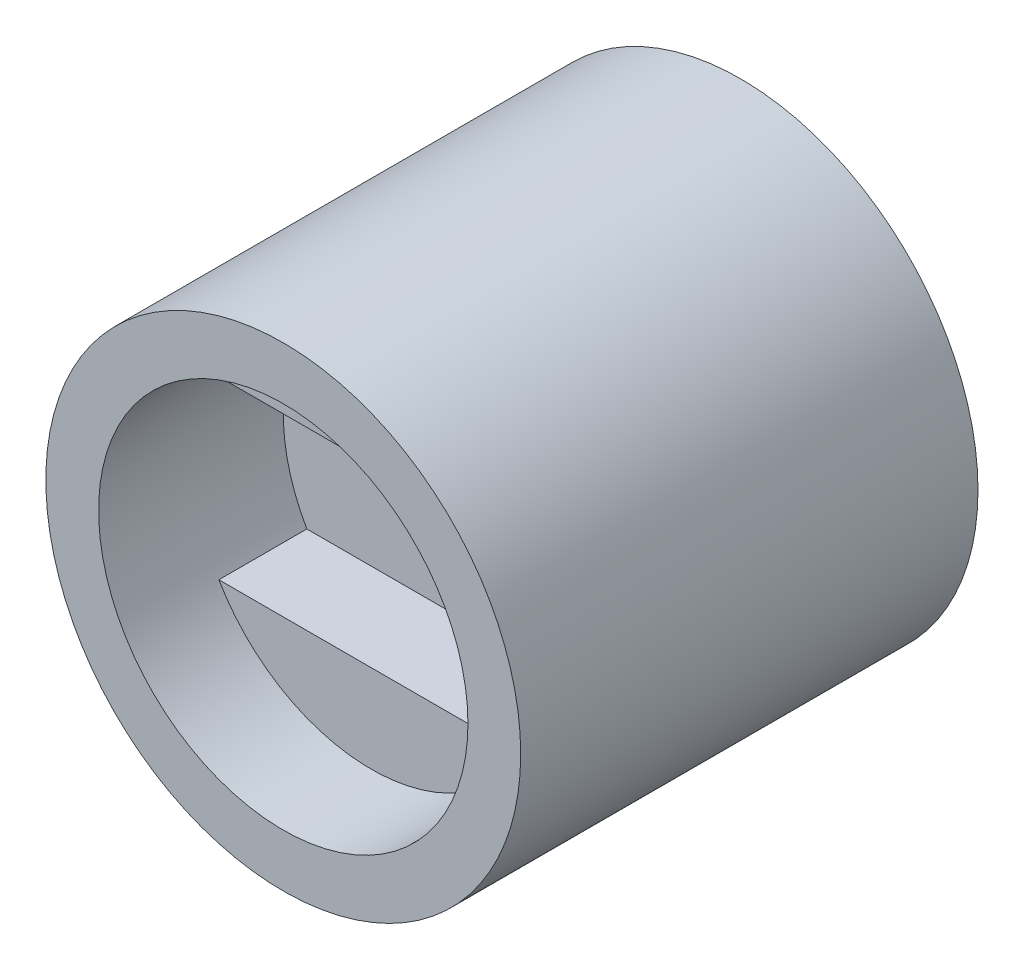
ISO-10303-21;
HEADER;
FILE_DESCRIPTION(('STEP AP214'),'2;1');
FILE_NAME('part.step','',(''),(''),'','','');
FILE_SCHEMA(('AUTOMOTIVE_DESIGN { 1 0 10303 214 1 1 1 1 }'));
ENDSEC;
DATA;
#1=APPLICATION_CONTEXT('core data for automotive mechanical design processes');
#2=APPLICATION_PROTOCOL_DEFINITION('international standard','automotive_design',2000,#1);
#3=PRODUCT_CONTEXT('',#1,'mechanical');
#4=PRODUCT('Part','Part','',(#3));
#5=PRODUCT_RELATED_PRODUCT_CATEGORY('part','',(#4));
#6=PRODUCT_DEFINITION_FORMATION('','',#4);
#7=PRODUCT_DEFINITION_CONTEXT('part definition',#1,'design');
#8=PRODUCT_DEFINITION('design','',#6,#7);
#9=PRODUCT_DEFINITION_SHAPE('','',#8);
#10=(LENGTH_UNIT() NAMED_UNIT(*) SI_UNIT(.MILLI.,.METRE.));
#11=(NAMED_UNIT(*) PLANE_ANGLE_UNIT() SI_UNIT($,.RADIAN.));
#12=(NAMED_UNIT(*) SI_UNIT($,.STERADIAN.) SOLID_ANGLE_UNIT());
#13=UNCERTAINTY_MEASURE_WITH_UNIT(LENGTH_MEASURE(1.E-05),#10,'distance_accuracy_value','');
#14=(GEOMETRIC_REPRESENTATION_CONTEXT(3) GLOBAL_UNCERTAINTY_ASSIGNED_CONTEXT((#13)) GLOBAL_UNIT_ASSIGNED_CONTEXT((#10,
#11,#12)) REPRESENTATION_CONTEXT('',''));
#15=CARTESIAN_POINT('',(0.,0.,0.));
#16=DIRECTION('',(0.,0.,1.));
#17=DIRECTION('',(1.,0.,0.));
#18=AXIS2_PLACEMENT_3D('',#15,#16,#17);
#19=CARTESIAN_POINT('',(0.,0.,-5.));
#20=DIRECTION('',(0.,0.,1.));
#21=DIRECTION('',(1.,0.,0.));
#22=AXIS2_PLACEMENT_3D('',#19,#20,#21);
#23=CYLINDRICAL_SURFACE('',#22,13.5);
#24=CARTESIAN_POINT('',(0.,0.,-5.));
#25=DIRECTION('',(0.,0.,1.));
#26=DIRECTION('',(1.,0.,0.));
#27=AXIS2_PLACEMENT_3D('',#24,#25,#26);
#28=CIRCLE('',#27,13.5);
#29=CARTESIAN_POINT('',(13.5,0.,-5.));
#30=VERTEX_POINT('',#29);
#31=EDGE_CURVE('E11',#30,#30,#28,.T.);
#32=CARTESIAN_POINT('',(0.,0.,21.));
#33=DIRECTION('',(0.,0.,1.));
#34=DIRECTION('',(1.,0.,0.));
#35=AXIS2_PLACEMENT_3D('',#32,#33,#34);
#36=CIRCLE('',#35,13.5);
#37=CARTESIAN_POINT('',(13.5,0.,21.));
#38=VERTEX_POINT('',#37);
#39=EDGE_CURVE('E48',#38,#38,#36,.T.);
#40=CARTESIAN_POINT('',(13.5,0.,-5.));
#41=CARTESIAN_POINT('',(13.5,0.,-4.72916666666667));
#42=CARTESIAN_POINT('',(13.5,0.,-4.45833333333333));
#43=CARTESIAN_POINT('',(13.5,0.,-3.91666666666667));
#44=CARTESIAN_POINT('',(13.5,0.,-3.64583333333333));
#45=CARTESIAN_POINT('',(13.5,0.,-3.10416666666667));
#46=CARTESIAN_POINT('',(13.5,0.,-2.83333333333333));
#47=CARTESIAN_POINT('',(13.5,0.,-2.29166666666667));
#48=CARTESIAN_POINT('',(13.5,0.,-2.02083333333333));
#49=CARTESIAN_POINT('',(13.5,0.,-1.47916666666667));
#50=CARTESIAN_POINT('',(13.5,0.,-1.20833333333334));
#51=CARTESIAN_POINT('',(13.5,0.,-0.666666666666668));
#52=CARTESIAN_POINT('',(13.5,0.,-0.395833333333335));
#53=CARTESIAN_POINT('',(13.5,0.,0.145833333333332));
#54=CARTESIAN_POINT('',(13.5,0.,0.416666666666666));
#55=CARTESIAN_POINT('',(13.5,0.,0.958333333333332));
#56=CARTESIAN_POINT('',(13.5,0.,1.22916666666667));
#57=CARTESIAN_POINT('',(13.5,0.,1.77083333333333));
#58=CARTESIAN_POINT('',(13.5,0.,2.04166666666667));
#59=CARTESIAN_POINT('',(13.5,0.,2.58333333333333));
#60=CARTESIAN_POINT('',(13.5,0.,2.85416666666666));
#61=CARTESIAN_POINT('',(13.5,0.,3.39583333333333));
#62=CARTESIAN_POINT('',(13.5,0.,3.66666666666666));
#63=CARTESIAN_POINT('',(13.5,0.,4.20833333333333));
#64=CARTESIAN_POINT('',(13.5,0.,4.47916666666667));
#65=CARTESIAN_POINT('',(13.5,0.,5.02083333333333));
#66=CARTESIAN_POINT('',(13.5,0.,5.29166666666667));
#67=CARTESIAN_POINT('',(13.5,0.,5.83333333333333));
#68=CARTESIAN_POINT('',(13.5,0.,6.10416666666667));
#69=CARTESIAN_POINT('',(13.5,0.,6.64583333333333));
#70=CARTESIAN_POINT('',(13.5,0.,6.91666666666666));
#71=CARTESIAN_POINT('',(13.5,0.,7.45833333333333));
#72=CARTESIAN_POINT('',(13.5,0.,7.72916666666666));
#73=CARTESIAN_POINT('',(13.5,0.,8.27083333333333));
#74=CARTESIAN_POINT('',(13.5,0.,8.54166666666667));
#75=CARTESIAN_POINT('',(13.5,0.,9.08333333333333));
#76=CARTESIAN_POINT('',(13.5,0.,9.35416666666666));
#77=CARTESIAN_POINT('',(13.5,0.,9.89583333333333));
#78=CARTESIAN_POINT('',(13.5,0.,10.1666666666667));
#79=CARTESIAN_POINT('',(13.5,0.,10.7083333333333));
#80=CARTESIAN_POINT('',(13.5,0.,10.9791666666667));
#81=CARTESIAN_POINT('',(13.5,0.,11.5208333333333));
#82=CARTESIAN_POINT('',(13.5,0.,11.7916666666667));
#83=CARTESIAN_POINT('',(13.5,0.,12.3333333333333));
#84=CARTESIAN_POINT('',(13.5,0.,12.6041666666667));
#85=CARTESIAN_POINT('',(13.5,0.,13.1458333333333));
#86=CARTESIAN_POINT('',(13.5,0.,13.4166666666667));
#87=CARTESIAN_POINT('',(13.5,0.,13.9583333333333));
#88=CARTESIAN_POINT('',(13.5,0.,14.2291666666667));
#89=CARTESIAN_POINT('',(13.5,0.,14.7708333333333));
#90=CARTESIAN_POINT('',(13.5,0.,15.0416666666667));
#91=CARTESIAN_POINT('',(13.5,0.,15.5833333333333));
#92=CARTESIAN_POINT('',(13.5,0.,15.8541666666667));
#93=CARTESIAN_POINT('',(13.5,0.,16.3958333333333));
#94=CARTESIAN_POINT('',(13.5,0.,16.6666666666667));
#95=CARTESIAN_POINT('',(13.5,0.,17.2083333333333));
#96=CARTESIAN_POINT('',(13.5,0.,17.4791666666667));
#97=CARTESIAN_POINT('',(13.5,0.,18.0208333333333));
#98=CARTESIAN_POINT('',(13.5,0.,18.2916666666667));
#99=CARTESIAN_POINT('',(13.5,0.,18.8333333333333));
#100=CARTESIAN_POINT('',(13.5,0.,19.1041666666667));
#101=CARTESIAN_POINT('',(13.5,0.,19.6458333333333));
#102=CARTESIAN_POINT('',(13.5,0.,19.9166666666667));
#103=CARTESIAN_POINT('',(13.5,0.,20.4583333333333));
#104=CARTESIAN_POINT('',(13.5,0.,20.7291666666667));
#105=CARTESIAN_POINT('',(13.5,0.,21.));
#106=B_SPLINE_CURVE_WITH_KNOTS('',3,(#40,#41,#42,#43,#44,#45,#46,#47,#48,#49,#50,#51,#52,#53,
#54,#55,#56,#57,#58,#59,#60,#61,#62,#63,#64,#65,#66,#67,#68,#69,#70,#71,#72,#73,#74,#75,#76,#77,
#78,#79,#80,#81,#82,#83,#84,#85,#86,#87,#88,#89,#90,#91,#92,#93,#94,#95,#96,#97,#98,#99,#100,
#101,#102,#103,#104,#105),.UNSPECIFIED.,.F.,.F.,(4,2,2,2,2,2,2,2,2,2,2,2,2,2,2,2,2,2,2,2,2,2,2,
2,2,2,2,2,2,2,2,2,4),(0.,0.8125,1.625,2.4375,3.25,4.0625,4.875,5.6875,6.5,7.3125,8.125,8.9375,
9.75,10.5625,11.375,12.1875,13.,13.8125,14.625,15.4375,16.25,17.0625,17.875,18.6875,19.5,
20.3125,21.125,21.9375,22.75,23.5625,24.375,25.1875,26.),.UNSPECIFIED.);
#107=EDGE_CURVE('BSEAM38',#30,#38,#106,.T.);
#108=ORIENTED_EDGE('',*,*,#31,.T.);
#109=ORIENTED_EDGE('',*,*,#39,.F.);
#110=ORIENTED_EDGE('',*,*,#107,.T.);
#111=ORIENTED_EDGE('',*,*,#107,.F.);
#112=EDGE_LOOP('',(#108,#110,#109,#111));
#113=FACE_BOUND('',#112,.T.);
#114=ADVANCED_FACE('F38',(#113),#23,.T.);
#115=CARTESIAN_POINT('',(0.,0.,-5.));
#116=DIRECTION('',(0.,0.,1.));
#117=DIRECTION('',(1.,0.,0.));
#118=AXIS2_PLACEMENT_3D('',#115,#116,#117);
#119=PLANE('',#118);
#120=CARTESIAN_POINT('',(0.,0.,-5.));
#121=DIRECTION('',(0.,0.,1.));
#122=DIRECTION('',(1.,0.,0.));
#123=AXIS2_PLACEMENT_3D('',#120,#121,#122);
#124=CIRCLE('',#123,10.5);
#125=CARTESIAN_POINT('',(10.5,0.,-5.));
#126=VERTEX_POINT('',#125);
#127=EDGE_CURVE('E44',#126,#126,#124,.T.);
#128=ORIENTED_EDGE('',*,*,#127,.T.);
#129=EDGE_LOOP('',(#128));
#130=FACE_BOUND('',#129,.T.);
#131=ORIENTED_EDGE('',*,*,#31,.F.);
#132=EDGE_LOOP('',(#131));
#133=FACE_BOUND('',#132,.T.);
#134=ADVANCED_FACE('F67',(#130,#133),#119,.F.);
#135=CARTESIAN_POINT('',(0.,0.,-5.));
#136=DIRECTION('',(0.,0.,1.));
#137=DIRECTION('',(1.,0.,0.));
#138=AXIS2_PLACEMENT_3D('',#135,#136,#137);
#139=CYLINDRICAL_SURFACE('',#138,10.5);
#140=CARTESIAN_POINT('',(0.,0.,21.));
#141=DIRECTION('',(0.,0.,1.));
#142=DIRECTION('',(1.,0.,0.));
#143=AXIS2_PLACEMENT_3D('',#140,#141,#142);
#144=CIRCLE('',#143,10.5);
#145=CARTESIAN_POINT('',(10.5,0.,21.));
#146=VERTEX_POINT('',#145);
#147=EDGE_CURVE('E52',#146,#146,#144,.T.);
#148=CARTESIAN_POINT('',(10.5,0.,-5.));
#149=CARTESIAN_POINT('',(10.5,0.,-4.72916666666667));
#150=CARTESIAN_POINT('',(10.5,0.,-4.45833333333333));
#151=CARTESIAN_POINT('',(10.5,0.,-3.91666666666667));
#152=CARTESIAN_POINT('',(10.5,0.,-3.64583333333333));
#153=CARTESIAN_POINT('',(10.5,0.,-3.10416666666667));
#154=CARTESIAN_POINT('',(10.5,0.,-2.83333333333333));
#155=CARTESIAN_POINT('',(10.5,0.,-2.29166666666667));
#156=CARTESIAN_POINT('',(10.5,0.,-2.02083333333333));
#157=CARTESIAN_POINT('',(10.5,0.,-1.47916666666667));
#158=CARTESIAN_POINT('',(10.5,0.,-1.20833333333334));
#159=CARTESIAN_POINT('',(10.5,0.,-0.666666666666669));
#160=CARTESIAN_POINT('',(10.5,0.,-0.395833333333335));
#161=CARTESIAN_POINT('',(10.5,0.,0.145833333333331));
#162=CARTESIAN_POINT('',(10.5,0.,0.416666666666665));
#163=CARTESIAN_POINT('',(10.5,0.,0.958333333333331));
#164=CARTESIAN_POINT('',(10.5,0.,1.22916666666666));
#165=CARTESIAN_POINT('',(10.5,0.,1.77083333333333));
#166=CARTESIAN_POINT('',(10.5,0.,2.04166666666666));
#167=CARTESIAN_POINT('',(10.5,0.,2.58333333333333));
#168=CARTESIAN_POINT('',(10.5,0.,2.85416666666666));
#169=CARTESIAN_POINT('',(10.5,0.,3.39583333333333));
#170=CARTESIAN_POINT('',(10.5,0.,3.66666666666666));
#171=CARTESIAN_POINT('',(10.5,0.,4.20833333333333));
#172=CARTESIAN_POINT('',(10.5,0.,4.47916666666667));
#173=CARTESIAN_POINT('',(10.5,0.,5.02083333333333));
#174=CARTESIAN_POINT('',(10.5,0.,5.29166666666667));
#175=CARTESIAN_POINT('',(10.5,0.,5.83333333333333));
#176=CARTESIAN_POINT('',(10.5,0.,6.10416666666667));
#177=CARTESIAN_POINT('',(10.5,0.,6.64583333333333));
#178=CARTESIAN_POINT('',(10.5,0.,6.91666666666666));
#179=CARTESIAN_POINT('',(10.5,0.,7.45833333333333));
#180=CARTESIAN_POINT('',(10.5,0.,7.72916666666666));
#181=CARTESIAN_POINT('',(10.5,0.,8.27083333333333));
#182=CARTESIAN_POINT('',(10.5,0.,8.54166666666667));
#183=CARTESIAN_POINT('',(10.5,0.,9.08333333333333));
#184=CARTESIAN_POINT('',(10.5,0.,9.35416666666666));
#185=CARTESIAN_POINT('',(10.5,0.,9.89583333333333));
#186=CARTESIAN_POINT('',(10.5,0.,10.1666666666667));
#187=CARTESIAN_POINT('',(10.5,0.,10.7083333333333));
#188=CARTESIAN_POINT('',(10.5,0.,10.9791666666667));
#189=CARTESIAN_POINT('',(10.5,0.,11.5208333333333));
#190=CARTESIAN_POINT('',(10.5,0.,11.7916666666667));
#191=CARTESIAN_POINT('',(10.5,0.,12.3333333333333));
#192=CARTESIAN_POINT('',(10.5,0.,12.6041666666667));
#193=CARTESIAN_POINT('',(10.5,0.,13.1458333333333));
#194=CARTESIAN_POINT('',(10.5,0.,13.4166666666667));
#195=CARTESIAN_POINT('',(10.5,0.,13.9583333333333));
#196=CARTESIAN_POINT('',(10.5,0.,14.2291666666667));
#197=CARTESIAN_POINT('',(10.5,0.,14.7708333333333));
#198=CARTESIAN_POINT('',(10.5,0.,15.0416666666667));
#199=CARTESIAN_POINT('',(10.5,0.,15.5833333333333));
#200=CARTESIAN_POINT('',(10.5,0.,15.8541666666667));
#201=CARTESIAN_POINT('',(10.5,0.,16.3958333333333));
#202=CARTESIAN_POINT('',(10.5,0.,16.6666666666667));
#203=CARTESIAN_POINT('',(10.5,0.,17.2083333333333));
#204=CARTESIAN_POINT('',(10.5,0.,17.4791666666667));
#205=CARTESIAN_POINT('',(10.5,0.,18.0208333333333));
#206=CARTESIAN_POINT('',(10.5,0.,18.2916666666667));
#207=CARTESIAN_POINT('',(10.5,0.,18.8333333333333));
#208=CARTESIAN_POINT('',(10.5,0.,19.1041666666667));
#209=CARTESIAN_POINT('',(10.5,0.,19.6458333333333));
#210=CARTESIAN_POINT('',(10.5,0.,19.9166666666667));
#211=CARTESIAN_POINT('',(10.5,0.,20.4583333333333));
#212=CARTESIAN_POINT('',(10.5,0.,20.7291666666667));
#213=CARTESIAN_POINT('',(10.5,0.,21.));
#214=B_SPLINE_CURVE_WITH_KNOTS('',3,(#148,#149,#150,#151,#152,#153,#154,#155,#156,#157,#158,
#159,#160,#161,#162,#163,#164,#165,#166,#167,#168,#169,#170,#171,#172,#173,#174,#175,#176,#177,
#178,#179,#180,#181,#182,#183,#184,#185,#186,#187,#188,#189,#190,#191,#192,#193,#194,#195,#196,
#197,#198,#199,#200,#201,#202,#203,#204,#205,#206,#207,#208,#209,#210,#211,#212,#213),
.UNSPECIFIED.,.F.,.F.,(4,2,2,2,2,2,2,2,2,2,2,2,2,2,2,2,2,2,2,2,2,2,2,2,2,2,2,2,2,2,2,2,4),(0.,
0.812500000000001,1.625,2.4375,3.25,4.0625,4.875,5.6875,6.5,7.3125,8.125,8.9375,9.75,10.5625,
11.375,12.1875,13.,13.8125,14.625,15.4375,16.25,17.0625,17.875,18.6875,19.5,20.3125,21.125,
21.9375,22.75,23.5625,24.375,25.1875,26.),.UNSPECIFIED.);
#215=EDGE_CURVE('BSEAM58',#126,#146,#214,.T.);
#216=ORIENTED_EDGE('',*,*,#127,.F.);
#217=ORIENTED_EDGE('',*,*,#147,.T.);
#218=ORIENTED_EDGE('',*,*,#215,.T.);
#219=ORIENTED_EDGE('',*,*,#215,.F.);
#220=EDGE_LOOP('',(#216,#218,#217,#219));
#221=FACE_BOUND('',#220,.T.);
#222=ADVANCED_FACE('F58',(#221),#139,.F.);
#223=CARTESIAN_POINT('',(0.,0.,21.));
#224=DIRECTION('',(0.,0.,1.));
#225=DIRECTION('',(1.,0.,0.));
#226=AXIS2_PLACEMENT_3D('',#223,#224,#225);
#227=PLANE('',#226);
#228=ORIENTED_EDGE('',*,*,#39,.T.);
#229=EDGE_LOOP('',(#228));
#230=FACE_BOUND('',#229,.T.);
#231=ORIENTED_EDGE('',*,*,#147,.F.);
#232=EDGE_LOOP('',(#231));
#233=FACE_BOUND('',#232,.T.);
#234=ADVANCED_FACE('F60',(#230,#233),#227,.T.);
#235=CLOSED_SHELL('',(#114,#134,#222,#234));
#236=MANIFOLD_SOLID_BREP('B2',#235);
#237=CARTESIAN_POINT('',(0.,0.,-0.001000000000001));
#238=DIRECTION('',(0.,0.,1.));
#239=DIRECTION('',(1.,0.,0.));
#240=AXIS2_PLACEMENT_3D('',#237,#238,#239);
#241=CYLINDRICAL_SURFACE('',#240,2.5);
#242=CARTESIAN_POINT('',(0.,0.,11.));
#243=DIRECTION('',(0.,0.,1.));
#244=DIRECTION('',(1.,0.,0.));
#245=AXIS2_PLACEMENT_3D('',#242,#243,#244);
#246=CIRCLE('',#245,2.5);
#247=CARTESIAN_POINT('',(2.5,0.,11.));
#248=VERTEX_POINT('',#247);
#249=EDGE_CURVE('E103',#248,#248,#246,.F.);
#250=ORIENTED_EDGE('',*,*,#249,.F.);
#251=EDGE_LOOP('',(#250));
#252=FACE_BOUND('',#251,.T.);
#253=CARTESIAN_POINT('',(0.,0.,5.));
#254=DIRECTION('',(0.,0.,-1.));
#255=DIRECTION('',(-1.,0.,0.));
#256=AXIS2_PLACEMENT_3D('',#253,#254,#255);
#257=CIRCLE('',#256,2.5);
#258=CARTESIAN_POINT('',(-2.5,0.,5.));
#259=VERTEX_POINT('',#258);
#260=EDGE_CURVE('E194',#259,#259,#257,.F.);
#261=ORIENTED_EDGE('',*,*,#260,.F.);
#262=EDGE_LOOP('',(#261));
#263=FACE_BOUND('',#262,.T.);
#264=ADVANCED_FACE('F99',(#252,#263),#241,.F.);
#265=CARTESIAN_POINT('',(0.,0.,0.));
#266=DIRECTION('',(0.,0.,1.));
#267=DIRECTION('',(1.,0.,0.));
#268=AXIS2_PLACEMENT_3D('',#265,#266,#267);
#269=PLANE('',#268);
#270=CARTESIAN_POINT('',(0.,0.,0.));
#271=DIRECTION('',(0.,0.,1.));
#272=DIRECTION('',(1.,0.,0.));
#273=AXIS2_PLACEMENT_3D('',#270,#271,#272);
#274=CIRCLE('',#273,10.);
#275=CARTESIAN_POINT('',(-5.,8.66025403784439,0.));
#276=VERTEX_POINT('',#275);
#277=CARTESIAN_POINT('',(-5.,-8.66025403784439,0.));
#278=VERTEX_POINT('',#277);
#279=EDGE_CURVE('E221',#276,#278,#274,.T.);
#280=ORIENTED_EDGE('',*,*,#279,.F.);
#281=DIRECTION('',(0.,1.,0.));
#282=VECTOR('',#281,1.);
#283=CARTESIAN_POINT('',(-5.,8.66025403784439,0.));
#284=LINE('',#283,#282);
#285=EDGE_CURVE('E182',#278,#276,#284,.T.);
#286=ORIENTED_EDGE('',*,*,#285,.F.);
#287=EDGE_LOOP('',(#280,#286));
#288=FACE_BOUND('',#287,.T.);
#289=ADVANCED_FACE('F230',(#288),#269,.F.);
#290=CARTESIAN_POINT('',(0.,0.,16.));
#291=DIRECTION('',(0.,0.,1.));
#292=DIRECTION('',(1.,0.,0.));
#293=AXIS2_PLACEMENT_3D('',#290,#291,#292);
#294=PLANE('',#293);
#295=DIRECTION('',(-1.,0.,0.));
#296=VECTOR('',#295,1.);
#297=CARTESIAN_POINT('',(-8.66025403784439,5.,16.));
#298=LINE('',#297,#296);
#299=CARTESIAN_POINT('',(8.66025403784439,5.,16.));
#300=VERTEX_POINT('',#299);
#301=CARTESIAN_POINT('',(-8.66025403784439,5.,16.));
#302=VERTEX_POINT('',#301);
#303=EDGE_CURVE('E203',#300,#302,#298,.T.);
#304=ORIENTED_EDGE('',*,*,#303,.F.);
#305=CARTESIAN_POINT('',(0.,0.,16.));
#306=DIRECTION('',(0.,0.,1.));
#307=DIRECTION('',(1.,0.,0.));
#308=AXIS2_PLACEMENT_3D('',#305,#306,#307);
#309=CIRCLE('',#308,10.);
#310=EDGE_CURVE('E36',#300,#302,#309,.T.);
#311=ORIENTED_EDGE('',*,*,#310,.T.);
#312=EDGE_LOOP('',(#304,#311));
#313=FACE_BOUND('',#312,.T.);
#314=ADVANCED_FACE('F258',(#313),#294,.T.);
#315=CARTESIAN_POINT('',(0.,0.,16.));
#316=DIRECTION('',(0.,0.,-1.));
#317=DIRECTION('',(-1.,0.,0.));
#318=AXIS2_PLACEMENT_3D('',#315,#316,#317);
#319=CYLINDRICAL_SURFACE('',#318,10.);
#320=CARTESIAN_POINT('',(0.,0.,5.));
#321=DIRECTION('',(0.,0.,-1.));
#322=DIRECTION('',(-1.,0.,0.));
#323=AXIS2_PLACEMENT_3D('',#320,#321,#322);
#324=CIRCLE('',#323,10.);
#325=CARTESIAN_POINT('',(-5.,8.66025403784439,5.));
#326=VERTEX_POINT('',#325);
#327=CARTESIAN_POINT('',(5.,8.66025403784439,5.));
#328=VERTEX_POINT('',#327);
#329=EDGE_CURVE('E172',#326,#328,#324,.T.);
#330=ORIENTED_EDGE('',*,*,#329,.F.);
#331=DIRECTION('',(0.,0.,-1.));
#332=VECTOR('',#331,1.);
#333=CARTESIAN_POINT('',(-5.,8.66025403784439,5.));
#334=LINE('',#333,#332);
#335=EDGE_CURVE('E198',#326,#276,#334,.T.);
#336=ORIENTED_EDGE('',*,*,#335,.T.);
#337=ORIENTED_EDGE('',*,*,#279,.T.);
#338=DIRECTION('',(0.,0.,-1.));
#339=VECTOR('',#338,1.);
#340=CARTESIAN_POINT('',(-5.,-8.66025403784439,5.));
#341=LINE('',#340,#339);
#342=CARTESIAN_POINT('',(-5.,-8.66025403784439,5.));
#343=VERTEX_POINT('',#342);
#344=EDGE_CURVE('E189',#343,#278,#341,.T.);
#345=ORIENTED_EDGE('',*,*,#344,.F.);
#346=CARTESIAN_POINT('',(0.,0.,5.));
#347=DIRECTION('',(0.,0.,-1.));
#348=DIRECTION('',(-1.,0.,0.));
#349=AXIS2_PLACEMENT_3D('',#346,#347,#348);
#350=CIRCLE('',#349,10.);
#351=CARTESIAN_POINT('',(5.,-8.66025403784439,5.));
#352=VERTEX_POINT('',#351);
#353=EDGE_CURVE('E171',#352,#343,#350,.T.);
#354=ORIENTED_EDGE('',*,*,#353,.F.);
#355=DIRECTION('',(0.,0.,-1.));
#356=VECTOR('',#355,1.);
#357=CARTESIAN_POINT('',(5.,-8.66025403784439,5.));
#358=LINE('',#357,#356);
#359=CARTESIAN_POINT('',(5.,-8.66025403784439,0.));
#360=VERTEX_POINT('',#359);
#361=EDGE_CURVE('E168',#352,#360,#358,.T.);
#362=ORIENTED_EDGE('',*,*,#361,.T.);
#363=CARTESIAN_POINT('',(5.,8.66025403784439,0.));
#364=VERTEX_POINT('',#363);
#365=EDGE_CURVE('E187',#360,#364,#274,.T.);
#366=ORIENTED_EDGE('',*,*,#365,.T.);
#367=DIRECTION('',(0.,0.,-1.));
#368=VECTOR('',#367,1.);
#369=CARTESIAN_POINT('',(5.,8.66025403784439,5.));
#370=LINE('',#369,#368);
#371=EDGE_CURVE('E116',#328,#364,#370,.T.);
#372=ORIENTED_EDGE('',*,*,#371,.F.);
#373=EDGE_LOOP('',(#330,#336,#337,#345,#354,#362,#366,#372));
#374=FACE_BOUND('',#373,.T.);
#375=CARTESIAN_POINT('',(0.,0.,11.));
#376=DIRECTION('',(0.,0.,1.));
#377=DIRECTION('',(1.,0.,0.));
#378=AXIS2_PLACEMENT_3D('',#375,#376,#377);
#379=CIRCLE('',#378,10.);
#380=CARTESIAN_POINT('',(-8.66025403784439,5.,11.));
#381=VERTEX_POINT('',#380);
#382=CARTESIAN_POINT('',(-8.66025403784439,-5.,11.));
#383=VERTEX_POINT('',#382);
#384=EDGE_CURVE('E199',#381,#383,#379,.T.);
#385=ORIENTED_EDGE('',*,*,#384,.F.);
#386=DIRECTION('',(0.,0.,1.));
#387=VECTOR('',#386,1.);
#388=CARTESIAN_POINT('',(-8.66025403784439,5.,11.));
#389=LINE('',#388,#387);
#390=EDGE_CURVE('E213',#381,#302,#389,.T.);
#391=ORIENTED_EDGE('',*,*,#390,.T.);
#392=ORIENTED_EDGE('',*,*,#310,.F.);
#393=DIRECTION('',(0.,0.,1.));
#394=VECTOR('',#393,1.);
#395=CARTESIAN_POINT('',(8.66025403784439,5.,11.));
#396=LINE('',#395,#394);
#397=CARTESIAN_POINT('',(8.66025403784439,5.,11.));
#398=VERTEX_POINT('',#397);
#399=EDGE_CURVE('E216',#398,#300,#396,.T.);
#400=ORIENTED_EDGE('',*,*,#399,.F.);
#401=CARTESIAN_POINT('',(0.,0.,11.));
#402=DIRECTION('',(0.,0.,1.));
#403=DIRECTION('',(1.,0.,0.));
#404=AXIS2_PLACEMENT_3D('',#401,#402,#403);
#405=CIRCLE('',#404,10.);
#406=CARTESIAN_POINT('',(8.66025403784439,-5.,11.));
#407=VERTEX_POINT('',#406);
#408=EDGE_CURVE('E206',#407,#398,#405,.T.);
#409=ORIENTED_EDGE('',*,*,#408,.F.);
#410=DIRECTION('',(0.,0.,1.));
#411=VECTOR('',#410,1.);
#412=CARTESIAN_POINT('',(8.66025403784439,-5.,11.));
#413=LINE('',#412,#411);
#414=CARTESIAN_POINT('',(8.66025403784439,-5.,16.));
#415=VERTEX_POINT('',#414);
#416=EDGE_CURVE('E218',#407,#415,#413,.T.);
#417=ORIENTED_EDGE('',*,*,#416,.T.);
#418=CARTESIAN_POINT('',(-8.66025403784439,-5.,16.));
#419=VERTEX_POINT('',#418);
#420=EDGE_CURVE('E108',#419,#415,#309,.T.);
#421=ORIENTED_EDGE('',*,*,#420,.F.);
#422=DIRECTION('',(0.,0.,1.));
#423=VECTOR('',#422,1.);
#424=CARTESIAN_POINT('',(-8.66025403784439,-5.,11.));
#425=LINE('',#424,#423);
#426=EDGE_CURVE('E124',#383,#419,#425,.T.);
#427=ORIENTED_EDGE('',*,*,#426,.F.);
#428=EDGE_LOOP('',(#385,#391,#392,#400,#409,#417,#421,#427));
#429=FACE_BOUND('',#428,.T.);
#430=ADVANCED_FACE('F101',(#374,#429),#319,.T.);
#431=DIRECTION('',(1.,0.,0.));
#432=VECTOR('',#431,1.);
#433=CARTESIAN_POINT('',(-8.66025403784439,-5.,16.));
#434=LINE('',#433,#432);
#435=EDGE_CURVE('E197',#419,#415,#434,.T.);
#436=ORIENTED_EDGE('',*,*,#435,.F.);
#437=ORIENTED_EDGE('',*,*,#420,.T.);
#438=EDGE_LOOP('',(#436,#437));
#439=FACE_BOUND('',#438,.T.);
#440=ADVANCED_FACE('F255',(#439),#294,.T.);
#441=ORIENTED_EDGE('',*,*,#365,.F.);
#442=DIRECTION('',(0.,-1.,0.));
#443=VECTOR('',#442,1.);
#444=CARTESIAN_POINT('',(5.,8.66025403784439,0.));
#445=LINE('',#444,#443);
#446=EDGE_CURVE('E275',#364,#360,#445,.T.);
#447=ORIENTED_EDGE('',*,*,#446,.F.);
#448=EDGE_LOOP('',(#441,#447));
#449=FACE_BOUND('',#448,.T.);
#450=ADVANCED_FACE('F250',(#449),#269,.F.);
#451=CARTESIAN_POINT('',(0.,0.,11.));
#452=DIRECTION('',(0.,0.,1.));
#453=DIRECTION('',(1.,0.,0.));
#454=AXIS2_PLACEMENT_3D('',#451,#452,#453);
#455=PLANE('',#454);
#456=ORIENTED_EDGE('',*,*,#384,.T.);
#457=DIRECTION('',(1.,0.,0.));
#458=VECTOR('',#457,1.);
#459=CARTESIAN_POINT('',(-8.66025403784439,-5.,11.));
#460=LINE('',#459,#458);
#461=EDGE_CURVE('E202',#383,#407,#460,.T.);
#462=ORIENTED_EDGE('',*,*,#461,.T.);
#463=ORIENTED_EDGE('',*,*,#408,.T.);
#464=DIRECTION('',(-1.,0.,0.));
#465=VECTOR('',#464,1.);
#466=CARTESIAN_POINT('',(-8.66025403784439,5.,11.));
#467=LINE('',#466,#465);
#468=EDGE_CURVE('E208',#398,#381,#467,.T.);
#469=ORIENTED_EDGE('',*,*,#468,.T.);
#470=EDGE_LOOP('',(#456,#462,#463,#469));
#471=FACE_BOUND('',#470,.T.);
#472=ORIENTED_EDGE('',*,*,#249,.T.);
#473=EDGE_LOOP('',(#472));
#474=FACE_BOUND('',#473,.T.);
#475=ADVANCED_FACE('F226',(#471,#474),#455,.T.);
#476=CARTESIAN_POINT('',(-8.66025403784439,5.,11.));
#477=DIRECTION('',(0.,1.,0.));
#478=DIRECTION('',(0.,0.,1.));
#479=AXIS2_PLACEMENT_3D('',#476,#477,#478);
#480=PLANE('',#479);
#481=ORIENTED_EDGE('',*,*,#303,.T.);
#482=ORIENTED_EDGE('',*,*,#390,.F.);
#483=ORIENTED_EDGE('',*,*,#468,.F.);
#484=ORIENTED_EDGE('',*,*,#399,.T.);
#485=EDGE_LOOP('',(#481,#482,#483,#484));
#486=FACE_BOUND('',#485,.T.);
#487=ADVANCED_FACE('F243',(#486),#480,.F.);
#488=CARTESIAN_POINT('',(-8.66025403784439,-5.,11.));
#489=DIRECTION('',(0.,-1.,0.));
#490=DIRECTION('',(0.,0.,-1.));
#491=AXIS2_PLACEMENT_3D('',#488,#489,#490);
#492=PLANE('',#491);
#493=ORIENTED_EDGE('',*,*,#435,.T.);
#494=ORIENTED_EDGE('',*,*,#416,.F.);
#495=ORIENTED_EDGE('',*,*,#461,.F.);
#496=ORIENTED_EDGE('',*,*,#426,.T.);
#497=EDGE_LOOP('',(#493,#494,#495,#496));
#498=FACE_BOUND('',#497,.T.);
#499=ADVANCED_FACE('F235',(#498),#492,.F.);
#500=CARTESIAN_POINT('',(0.,0.,5.));
#501=DIRECTION('',(0.,0.,-1.));
#502=DIRECTION('',(-1.,0.,0.));
#503=AXIS2_PLACEMENT_3D('',#500,#501,#502);
#504=PLANE('',#503);
#505=ORIENTED_EDGE('',*,*,#329,.T.);
#506=DIRECTION('',(0.,-1.,0.));
#507=VECTOR('',#506,1.);
#508=CARTESIAN_POINT('',(5.,8.66025403784439,5.));
#509=LINE('',#508,#507);
#510=EDGE_CURVE('E164',#328,#352,#509,.T.);
#511=ORIENTED_EDGE('',*,*,#510,.T.);
#512=ORIENTED_EDGE('',*,*,#353,.T.);
#513=DIRECTION('',(0.,1.,0.));
#514=VECTOR('',#513,1.);
#515=CARTESIAN_POINT('',(-5.,8.66025403784439,5.));
#516=LINE('',#515,#514);
#517=EDGE_CURVE('E179',#343,#326,#516,.T.);
#518=ORIENTED_EDGE('',*,*,#517,.T.);
#519=EDGE_LOOP('',(#505,#511,#512,#518));
#520=FACE_BOUND('',#519,.T.);
#521=ORIENTED_EDGE('',*,*,#260,.T.);
#522=EDGE_LOOP('',(#521));
#523=FACE_BOUND('',#522,.T.);
#524=ADVANCED_FACE('F176',(#520,#523),#504,.T.);
#525=CARTESIAN_POINT('',(-5.,8.66025403784439,5.));
#526=DIRECTION('',(-1.,0.,0.));
#527=DIRECTION('',(0.,0.,1.));
#528=AXIS2_PLACEMENT_3D('',#525,#526,#527);
#529=PLANE('',#528);
#530=ORIENTED_EDGE('',*,*,#285,.T.);
#531=ORIENTED_EDGE('',*,*,#335,.F.);
#532=ORIENTED_EDGE('',*,*,#517,.F.);
#533=ORIENTED_EDGE('',*,*,#344,.T.);
#534=EDGE_LOOP('',(#530,#531,#532,#533));
#535=FACE_BOUND('',#534,.T.);
#536=ADVANCED_FACE('F234',(#535),#529,.F.);
#537=CARTESIAN_POINT('',(5.,8.66025403784439,5.));
#538=DIRECTION('',(1.,0.,0.));
#539=DIRECTION('',(0.,0.,-1.));
#540=AXIS2_PLACEMENT_3D('',#537,#538,#539);
#541=PLANE('',#540);
#542=ORIENTED_EDGE('',*,*,#446,.T.);
#543=ORIENTED_EDGE('',*,*,#361,.F.);
#544=ORIENTED_EDGE('',*,*,#510,.F.);
#545=ORIENTED_EDGE('',*,*,#371,.T.);
#546=EDGE_LOOP('',(#542,#543,#544,#545));
#547=FACE_BOUND('',#546,.T.);
#548=ADVANCED_FACE('F166',(#547),#541,.F.);
#549=CLOSED_SHELL('',(#264,#289,#314,#430,#440,#450,#475,#487,#499,#524,#536,#548));
#550=MANIFOLD_SOLID_BREP('B6',#549);
#551=ADVANCED_BREP_SHAPE_REPRESENTATION('',(#18,#236,#550),#14);
#552=SHAPE_DEFINITION_REPRESENTATION(#9,#551);
ENDSEC;
END-ISO-10303-21;
